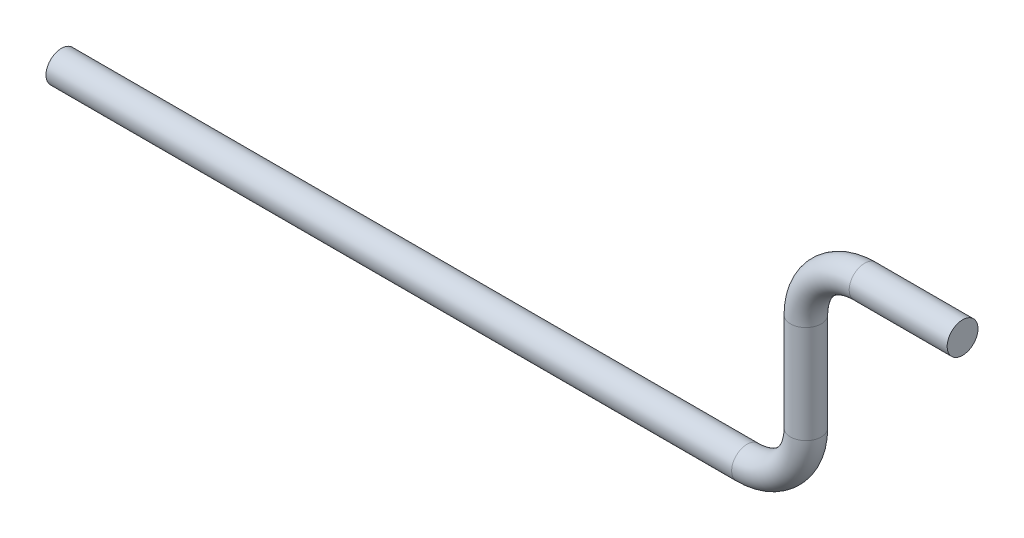
ISO-10303-21;
HEADER;
FILE_DESCRIPTION(('STEP AP214'),'2;1');
FILE_NAME('part.step','',(''),(''),'','','');
FILE_SCHEMA(('AUTOMOTIVE_DESIGN { 1 0 10303 214 1 1 1 1 }'));
ENDSEC;
DATA;
#1=APPLICATION_CONTEXT('core data for automotive mechanical design processes');
#2=APPLICATION_PROTOCOL_DEFINITION('international standard','automotive_design',2000,#1);
#3=PRODUCT_CONTEXT('',#1,'mechanical');
#4=PRODUCT('Part','Part','',(#3));
#5=PRODUCT_RELATED_PRODUCT_CATEGORY('part','',(#4));
#6=PRODUCT_DEFINITION_FORMATION('','',#4);
#7=PRODUCT_DEFINITION_CONTEXT('part definition',#1,'design');
#8=PRODUCT_DEFINITION('design','',#6,#7);
#9=PRODUCT_DEFINITION_SHAPE('','',#8);
#10=(LENGTH_UNIT() NAMED_UNIT(*) SI_UNIT(.MILLI.,.METRE.));
#11=(NAMED_UNIT(*) PLANE_ANGLE_UNIT() SI_UNIT($,.RADIAN.));
#12=(NAMED_UNIT(*) SI_UNIT($,.STERADIAN.) SOLID_ANGLE_UNIT());
#13=UNCERTAINTY_MEASURE_WITH_UNIT(LENGTH_MEASURE(1.E-05),#10,'distance_accuracy_value','');
#14=(GEOMETRIC_REPRESENTATION_CONTEXT(3) GLOBAL_UNCERTAINTY_ASSIGNED_CONTEXT((#13)) GLOBAL_UNIT_ASSIGNED_CONTEXT((#10,
#11,#12)) REPRESENTATION_CONTEXT('',''));
#15=CARTESIAN_POINT('',(0.,0.,0.));
#16=DIRECTION('',(0.,0.,1.));
#17=DIRECTION('',(1.,0.,0.));
#18=AXIS2_PLACEMENT_3D('',#15,#16,#17);
#19=CARTESIAN_POINT('',(119.329430880944,22.0000000000001,0.));
#20=DIRECTION('',(1.,0.,0.));
#21=DIRECTION('',(0.,1.,0.));
#22=AXIS2_PLACEMENT_3D('',#19,#20,#21);
#23=CYLINDRICAL_SURFACE('',#22,1.575);
#24=CARTESIAN_POINT('',(119.329430880944,22.0000000000001,0.));
#25=DIRECTION('',(1.,0.,0.));
#26=DIRECTION('',(0.,0.,-1.));
#27=AXIS2_PLACEMENT_3D('',#24,#25,#26);
#28=CIRCLE('',#27,1.575);
#29=CARTESIAN_POINT('',(119.329430880944,23.5750000000001,0.));
#30=VERTEX_POINT('',#29);
#31=EDGE_CURVE('E35',#30,#30,#28,.T.);
#32=ORIENTED_EDGE('',*,*,#31,.T.);
#33=EDGE_LOOP('',(#32));
#34=FACE_BOUND('',#33,.T.);
#35=CARTESIAN_POINT('',(129.329430880944,22.,0.));
#36=DIRECTION('',(1.,0.,0.));
#37=DIRECTION('',(0.,0.,-1.));
#38=AXIS2_PLACEMENT_3D('',#35,#36,#37);
#39=CIRCLE('',#38,1.575);
#40=CARTESIAN_POINT('',(129.329430880944,22.,-1.57500000000001));
#41=VERTEX_POINT('',#40);
#42=EDGE_CURVE('E10',#41,#41,#39,.T.);
#43=ORIENTED_EDGE('',*,*,#42,.F.);
#44=EDGE_LOOP('',(#43));
#45=FACE_BOUND('',#44,.T.);
#46=ADVANCED_FACE('F29',(#34,#45),#23,.T.);
#47=CARTESIAN_POINT('',(119.329430880944,16.,0.));
#48=DIRECTION('',(0.,0.,-1.));
#49=DIRECTION('',(-1.,0.,0.));
#50=AXIS2_PLACEMENT_3D('',#47,#48,#49);
#51=TOROIDAL_SURFACE('',#50,6.00000000000002,1.575);
#52=CARTESIAN_POINT('',(113.329430880944,16.,0.));
#53=DIRECTION('',(0.,1.,0.));
#54=DIRECTION('',(0.,0.,-1.));
#55=AXIS2_PLACEMENT_3D('',#52,#53,#54);
#56=CIRCLE('',#55,1.575);
#57=CARTESIAN_POINT('',(111.754430880944,16.,0.));
#58=VERTEX_POINT('',#57);
#59=EDGE_CURVE('E39',#58,#58,#56,.T.);
#60=CARTESIAN_POINT('',(119.329430880944,16.,0.));
#61=DIRECTION('',(0.,0.,-1.));
#62=DIRECTION('',(-1.,0.,0.));
#63=AXIS2_PLACEMENT_3D('',#60,#61,#62);
#64=CIRCLE('',#63,7.57500000000002);
#65=EDGE_CURVE('',#58,#30,#64,.T.);
#66=ORIENTED_EDGE('',*,*,#59,.T.);
#67=ORIENTED_EDGE('',*,*,#31,.F.);
#68=ORIENTED_EDGE('',*,*,#65,.T.);
#69=ORIENTED_EDGE('',*,*,#65,.F.);
#70=EDGE_LOOP('',(#66,#68,#67,#69));
#71=FACE_BOUND('',#70,.T.);
#72=ADVANCED_FACE('F73',(#71),#51,.T.);
#73=CARTESIAN_POINT('',(113.329430880944,6.00000000000004,0.));
#74=DIRECTION('',(0.,1.,0.));
#75=DIRECTION('',(-1.,0.,0.));
#76=AXIS2_PLACEMENT_3D('',#73,#74,#75);
#77=CYLINDRICAL_SURFACE('',#76,1.575);
#78=CARTESIAN_POINT('',(113.329430880944,6.00000000000004,0.));
#79=DIRECTION('',(0.,1.,0.));
#80=DIRECTION('',(0.,0.,-1.));
#81=AXIS2_PLACEMENT_3D('',#78,#79,#80);
#82=CIRCLE('',#81,1.575);
#83=CARTESIAN_POINT('',(114.904430880944,6.00000000000004,0.));
#84=VERTEX_POINT('',#83);
#85=EDGE_CURVE('E43',#84,#84,#82,.T.);
#86=ORIENTED_EDGE('',*,*,#85,.T.);
#87=EDGE_LOOP('',(#86));
#88=FACE_BOUND('',#87,.T.);
#89=ORIENTED_EDGE('',*,*,#59,.F.);
#90=EDGE_LOOP('',(#89));
#91=FACE_BOUND('',#90,.T.);
#92=ADVANCED_FACE('F77',(#88,#91),#77,.T.);
#93=CARTESIAN_POINT('',(107.329430880944,6.00000000000003,0.));
#94=DIRECTION('',(0.,0.,1.));
#95=DIRECTION('',(1.,0.,0.));
#96=AXIS2_PLACEMENT_3D('',#93,#94,#95);
#97=TOROIDAL_SURFACE('',#96,6.,1.575);
#98=CARTESIAN_POINT('',(107.329430880944,0.,0.));
#99=DIRECTION('',(1.,0.,0.));
#100=DIRECTION('',(0.,0.,-1.));
#101=AXIS2_PLACEMENT_3D('',#98,#99,#100);
#102=CIRCLE('',#101,1.575);
#103=CARTESIAN_POINT('',(107.329430880944,-1.57499999999997,0.));
#104=VERTEX_POINT('',#103);
#105=EDGE_CURVE('E48',#104,#104,#102,.T.);
#106=CARTESIAN_POINT('',(107.329430880944,6.00000000000003,0.));
#107=DIRECTION('',(0.,0.,1.));
#108=DIRECTION('',(1.,0.,0.));
#109=AXIS2_PLACEMENT_3D('',#106,#107,#108);
#110=CIRCLE('',#109,7.575);
#111=EDGE_CURVE('',#104,#84,#110,.T.);
#112=ORIENTED_EDGE('',*,*,#105,.T.);
#113=ORIENTED_EDGE('',*,*,#85,.F.);
#114=ORIENTED_EDGE('',*,*,#111,.T.);
#115=ORIENTED_EDGE('',*,*,#111,.F.);
#116=EDGE_LOOP('',(#112,#114,#113,#115));
#117=FACE_BOUND('',#116,.T.);
#118=ADVANCED_FACE('F55',(#117),#97,.T.);
#119=CARTESIAN_POINT('',(107.329430880944,0.,0.));
#120=DIRECTION('',(-1.,0.,0.));
#121=DIRECTION('',(0.,0.,1.));
#122=AXIS2_PLACEMENT_3D('',#119,#120,#121);
#123=CYLINDRICAL_SURFACE('',#122,1.575);
#124=ORIENTED_EDGE('',*,*,#105,.F.);
#125=EDGE_LOOP('',(#124));
#126=FACE_BOUND('',#125,.T.);
#127=CARTESIAN_POINT('',(37.3294308809441,0.,0.));
#128=DIRECTION('',(1.,0.,0.));
#129=DIRECTION('',(0.,0.,-1.));
#130=AXIS2_PLACEMENT_3D('',#127,#128,#129);
#131=CIRCLE('',#130,1.575);
#132=CARTESIAN_POINT('',(37.3294308809441,0.,-1.57500000000003));
#133=VERTEX_POINT('',#132);
#134=EDGE_CURVE('E49',#133,#133,#131,.T.);
#135=ORIENTED_EDGE('',*,*,#134,.T.);
#136=EDGE_LOOP('',(#135));
#137=FACE_BOUND('',#136,.T.);
#138=ADVANCED_FACE('F58',(#126,#137),#123,.T.);
#139=CARTESIAN_POINT('',(129.329430880944,22.,0.));
#140=DIRECTION('',(1.,0.,0.));
#141=DIRECTION('',(0.,0.,-1.));
#142=AXIS2_PLACEMENT_3D('',#139,#140,#141);
#143=PLANE('',#142);
#144=ORIENTED_EDGE('',*,*,#42,.T.);
#145=EDGE_LOOP('',(#144));
#146=FACE_BOUND('',#145,.T.);
#147=ADVANCED_FACE('F61',(#146),#143,.T.);
#148=CARTESIAN_POINT('',(37.3294308809441,0.,0.));
#149=DIRECTION('',(1.,0.,0.));
#150=DIRECTION('',(0.,0.,-1.));
#151=AXIS2_PLACEMENT_3D('',#148,#149,#150);
#152=PLANE('',#151);
#153=ORIENTED_EDGE('',*,*,#134,.F.);
#154=EDGE_LOOP('',(#153));
#155=FACE_BOUND('',#154,.T.);
#156=ADVANCED_FACE('F65',(#155),#152,.F.);
#157=CLOSED_SHELL('',(#46,#72,#92,#118,#138,#147,#156));
#158=MANIFOLD_SOLID_BREP('B2',#157);
#159=ADVANCED_BREP_SHAPE_REPRESENTATION('',(#18,#158),#14);
#160=SHAPE_DEFINITION_REPRESENTATION(#9,#159);
ENDSEC;
END-ISO-10303-21;
